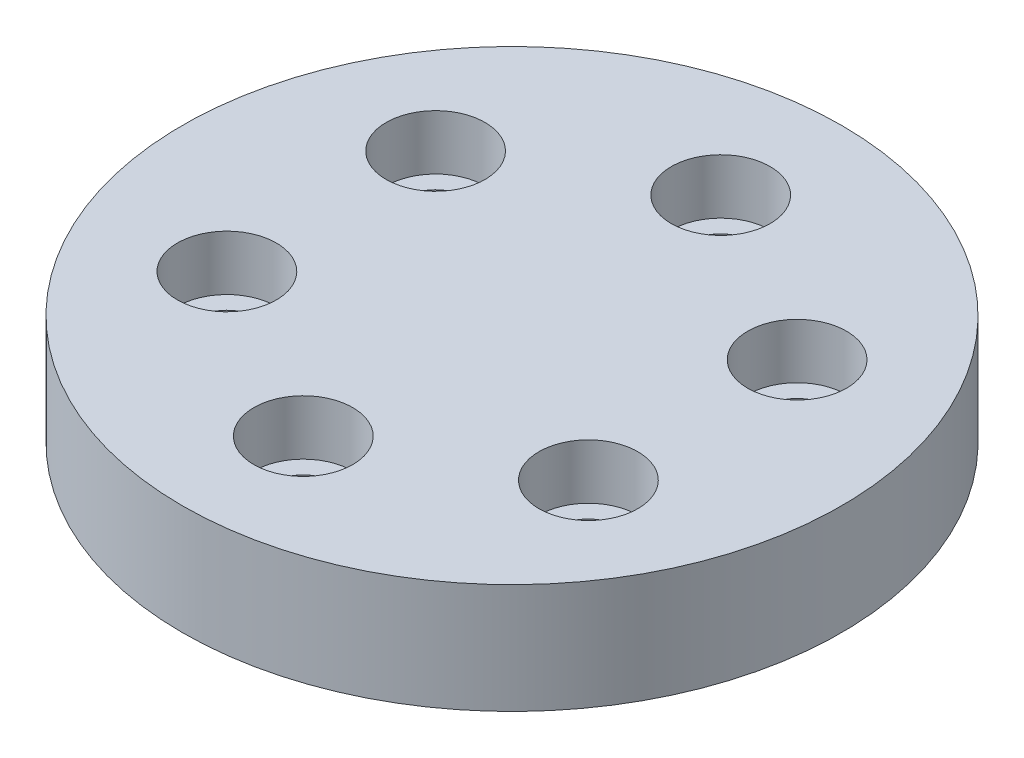
ISO-10303-21;
HEADER;
FILE_DESCRIPTION(('STEP AP214'),'2;1');
FILE_NAME('part.step','',(''),(''),'','','');
FILE_SCHEMA(('AUTOMOTIVE_DESIGN { 1 0 10303 214 1 1 1 1 }'));
ENDSEC;
DATA;
#1=APPLICATION_CONTEXT('core data for automotive mechanical design processes');
#2=APPLICATION_PROTOCOL_DEFINITION('international standard','automotive_design',2000,#1);
#3=PRODUCT_CONTEXT('',#1,'mechanical');
#4=PRODUCT('Part','Part','',(#3));
#5=PRODUCT_RELATED_PRODUCT_CATEGORY('part','',(#4));
#6=PRODUCT_DEFINITION_FORMATION('','',#4);
#7=PRODUCT_DEFINITION_CONTEXT('part definition',#1,'design');
#8=PRODUCT_DEFINITION('design','',#6,#7);
#9=PRODUCT_DEFINITION_SHAPE('','',#8);
#10=(LENGTH_UNIT() NAMED_UNIT(*) SI_UNIT(.MILLI.,.METRE.));
#11=(NAMED_UNIT(*) PLANE_ANGLE_UNIT() SI_UNIT($,.RADIAN.));
#12=(NAMED_UNIT(*) SI_UNIT($,.STERADIAN.) SOLID_ANGLE_UNIT());
#13=UNCERTAINTY_MEASURE_WITH_UNIT(LENGTH_MEASURE(1.E-05),#10,'distance_accuracy_value','');
#14=(GEOMETRIC_REPRESENTATION_CONTEXT(3) GLOBAL_UNCERTAINTY_ASSIGNED_CONTEXT((#13)) GLOBAL_UNIT_ASSIGNED_CONTEXT((#10,
#11,#12)) REPRESENTATION_CONTEXT('',''));
#15=CARTESIAN_POINT('',(0.,0.,0.));
#16=DIRECTION('',(0.,0.,1.));
#17=DIRECTION('',(1.,0.,0.));
#18=AXIS2_PLACEMENT_3D('',#15,#16,#17);
#19=CARTESIAN_POINT('',(0.,10.,0.));
#20=DIRECTION('',(0.,-1.,0.));
#21=DIRECTION('',(0.,0.,-1.));
#22=AXIS2_PLACEMENT_3D('',#19,#20,#21);
#23=CYLINDRICAL_SURFACE('',#22,30.);
#24=CARTESIAN_POINT('',(0.,10.,0.));
#25=DIRECTION('',(0.,1.,0.));
#26=DIRECTION('',(0.,0.,1.));
#27=AXIS2_PLACEMENT_3D('',#24,#25,#26);
#28=CIRCLE('',#27,30.);
#29=CARTESIAN_POINT('',(0.,10.,30.));
#30=VERTEX_POINT('',#29);
#31=EDGE_CURVE('E10',#30,#30,#28,.T.);
#32=ORIENTED_EDGE('',*,*,#31,.F.);
#33=EDGE_LOOP('',(#32));
#34=FACE_BOUND('',#33,.T.);
#35=CARTESIAN_POINT('',(0.,0.,0.));
#36=DIRECTION('',(0.,1.,0.));
#37=DIRECTION('',(0.,0.,1.));
#38=AXIS2_PLACEMENT_3D('',#35,#36,#37);
#39=CIRCLE('',#38,30.);
#40=CARTESIAN_POINT('',(0.,0.,30.));
#41=VERTEX_POINT('',#40);
#42=EDGE_CURVE('E46',#41,#41,#39,.T.);
#43=ORIENTED_EDGE('',*,*,#42,.T.);
#44=EDGE_LOOP('',(#43));
#45=FACE_BOUND('',#44,.T.);
#46=ADVANCED_FACE('F43',(#34,#45),#23,.T.);
#47=CARTESIAN_POINT('',(0.,10.,0.));
#48=DIRECTION('',(0.,1.,0.));
#49=DIRECTION('',(0.,0.,1.));
#50=AXIS2_PLACEMENT_3D('',#47,#48,#49);
#51=PLANE('',#50);
#52=CARTESIAN_POINT('',(0.,10.,-19.));
#53=DIRECTION('',(0.,1.,0.));
#54=DIRECTION('',(0.,0.,1.));
#55=AXIS2_PLACEMENT_3D('',#52,#53,#54);
#56=CIRCLE('',#55,4.5);
#57=CARTESIAN_POINT('',(0.,10.,-14.5));
#58=VERTEX_POINT('',#57);
#59=EDGE_CURVE('E90',#58,#58,#56,.T.);
#60=ORIENTED_EDGE('',*,*,#59,.F.);
#61=EDGE_LOOP('',(#60));
#62=FACE_BOUND('',#61,.T.);
#63=CARTESIAN_POINT('',(-16.4544826719043,10.,-9.5));
#64=DIRECTION('',(0.,1.,0.));
#65=DIRECTION('',(0.,0.,1.));
#66=AXIS2_PLACEMENT_3D('',#63,#64,#65);
#67=CIRCLE('',#66,4.5);
#68=CARTESIAN_POINT('',(-16.4544826719043,10.,-5.));
#69=VERTEX_POINT('',#68);
#70=EDGE_CURVE('E62',#69,#69,#67,.T.);
#71=ORIENTED_EDGE('',*,*,#70,.F.);
#72=EDGE_LOOP('',(#71));
#73=FACE_BOUND('',#72,.T.);
#74=CARTESIAN_POINT('',(-16.4544826719043,10.,9.50000000000001));
#75=DIRECTION('',(0.,1.,0.));
#76=DIRECTION('',(0.,0.,1.));
#77=AXIS2_PLACEMENT_3D('',#74,#75,#76);
#78=CIRCLE('',#77,4.5);
#79=CARTESIAN_POINT('',(-16.4544826719043,10.,14.));
#80=VERTEX_POINT('',#79);
#81=EDGE_CURVE('E61',#80,#80,#78,.T.);
#82=ORIENTED_EDGE('',*,*,#81,.F.);
#83=EDGE_LOOP('',(#82));
#84=FACE_BOUND('',#83,.T.);
#85=CARTESIAN_POINT('',(0.,10.,19.));
#86=DIRECTION('',(0.,1.,0.));
#87=DIRECTION('',(0.,0.,1.));
#88=AXIS2_PLACEMENT_3D('',#85,#86,#87);
#89=CIRCLE('',#88,4.5);
#90=CARTESIAN_POINT('',(0.,10.,23.5));
#91=VERTEX_POINT('',#90);
#92=EDGE_CURVE('E70',#91,#91,#89,.T.);
#93=ORIENTED_EDGE('',*,*,#92,.F.);
#94=EDGE_LOOP('',(#93));
#95=FACE_BOUND('',#94,.T.);
#96=CARTESIAN_POINT('',(16.4544826719043,10.,9.5));
#97=DIRECTION('',(0.,1.,0.));
#98=DIRECTION('',(0.,0.,1.));
#99=AXIS2_PLACEMENT_3D('',#96,#97,#98);
#100=CIRCLE('',#99,4.5);
#101=CARTESIAN_POINT('',(16.4544826719043,10.,14.));
#102=VERTEX_POINT('',#101);
#103=EDGE_CURVE('E78',#102,#102,#100,.T.);
#104=ORIENTED_EDGE('',*,*,#103,.F.);
#105=EDGE_LOOP('',(#104));
#106=FACE_BOUND('',#105,.T.);
#107=CARTESIAN_POINT('',(16.4544826719043,10.,-9.5));
#108=DIRECTION('',(0.,1.,0.));
#109=DIRECTION('',(0.,0.,1.));
#110=AXIS2_PLACEMENT_3D('',#107,#108,#109);
#111=CIRCLE('',#110,4.5);
#112=CARTESIAN_POINT('',(16.4544826719043,10.,-5.));
#113=VERTEX_POINT('',#112);
#114=EDGE_CURVE('E86',#113,#113,#111,.T.);
#115=ORIENTED_EDGE('',*,*,#114,.F.);
#116=EDGE_LOOP('',(#115));
#117=FACE_BOUND('',#116,.T.);
#118=ORIENTED_EDGE('',*,*,#31,.T.);
#119=EDGE_LOOP('',(#118));
#120=FACE_BOUND('',#119,.T.);
#121=ADVANCED_FACE('F177',(#62,#73,#84,#95,#106,#117,#120),#51,.T.);
#122=CARTESIAN_POINT('',(0.,0.,0.));
#123=DIRECTION('',(0.,1.,0.));
#124=DIRECTION('',(0.,0.,1.));
#125=AXIS2_PLACEMENT_3D('',#122,#123,#124);
#126=PLANE('',#125);
#127=CARTESIAN_POINT('',(0.,0.,-19.));
#128=DIRECTION('',(0.,1.,0.));
#129=DIRECTION('',(0.,0.,1.));
#130=AXIS2_PLACEMENT_3D('',#127,#128,#129);
#131=CIRCLE('',#130,2.75);
#132=CARTESIAN_POINT('',(0.,0.,-16.25));
#133=VERTEX_POINT('',#132);
#134=EDGE_CURVE('E95',#133,#133,#131,.T.);
#135=ORIENTED_EDGE('',*,*,#134,.T.);
#136=EDGE_LOOP('',(#135));
#137=FACE_BOUND('',#136,.T.);
#138=CARTESIAN_POINT('',(-16.4544826719043,0.,-9.5));
#139=DIRECTION('',(0.,1.,0.));
#140=DIRECTION('',(0.,0.,1.));
#141=AXIS2_PLACEMENT_3D('',#138,#139,#140);
#142=CIRCLE('',#141,2.75);
#143=CARTESIAN_POINT('',(-16.4544826719043,0.,-6.75));
#144=VERTEX_POINT('',#143);
#145=EDGE_CURVE('E139',#144,#144,#142,.T.);
#146=ORIENTED_EDGE('',*,*,#145,.T.);
#147=EDGE_LOOP('',(#146));
#148=FACE_BOUND('',#147,.T.);
#149=CARTESIAN_POINT('',(-16.4544826719043,0.,9.50000000000001));
#150=DIRECTION('',(0.,1.,0.));
#151=DIRECTION('',(0.,0.,1.));
#152=AXIS2_PLACEMENT_3D('',#149,#150,#151);
#153=CIRCLE('',#152,2.75);
#154=CARTESIAN_POINT('',(-16.4544826719043,0.,12.25));
#155=VERTEX_POINT('',#154);
#156=EDGE_CURVE('E105',#155,#155,#153,.T.);
#157=ORIENTED_EDGE('',*,*,#156,.T.);
#158=EDGE_LOOP('',(#157));
#159=FACE_BOUND('',#158,.T.);
#160=CARTESIAN_POINT('',(0.,0.,19.));
#161=DIRECTION('',(0.,1.,0.));
#162=DIRECTION('',(0.,0.,1.));
#163=AXIS2_PLACEMENT_3D('',#160,#161,#162);
#164=CIRCLE('',#163,2.75);
#165=CARTESIAN_POINT('',(0.,0.,21.75));
#166=VERTEX_POINT('',#165);
#167=EDGE_CURVE('E114',#166,#166,#164,.T.);
#168=ORIENTED_EDGE('',*,*,#167,.T.);
#169=EDGE_LOOP('',(#168));
#170=FACE_BOUND('',#169,.T.);
#171=CARTESIAN_POINT('',(16.4544826719043,0.,9.5));
#172=DIRECTION('',(0.,1.,0.));
#173=DIRECTION('',(0.,0.,1.));
#174=AXIS2_PLACEMENT_3D('',#171,#172,#173);
#175=CIRCLE('',#174,2.75);
#176=CARTESIAN_POINT('',(16.4544826719043,0.,12.25));
#177=VERTEX_POINT('',#176);
#178=EDGE_CURVE('E122',#177,#177,#175,.T.);
#179=ORIENTED_EDGE('',*,*,#178,.T.);
#180=EDGE_LOOP('',(#179));
#181=FACE_BOUND('',#180,.T.);
#182=CARTESIAN_POINT('',(16.4544826719043,0.,-9.5));
#183=DIRECTION('',(0.,1.,0.));
#184=DIRECTION('',(0.,0.,1.));
#185=AXIS2_PLACEMENT_3D('',#182,#183,#184);
#186=CIRCLE('',#185,2.75);
#187=CARTESIAN_POINT('',(16.4544826719043,0.,-6.75));
#188=VERTEX_POINT('',#187);
#189=EDGE_CURVE('E130',#188,#188,#186,.T.);
#190=ORIENTED_EDGE('',*,*,#189,.T.);
#191=EDGE_LOOP('',(#190));
#192=FACE_BOUND('',#191,.T.);
#193=ORIENTED_EDGE('',*,*,#42,.F.);
#194=EDGE_LOOP('',(#193));
#195=FACE_BOUND('',#194,.T.);
#196=ADVANCED_FACE('F153',(#137,#148,#159,#170,#181,#192,#195),#126,.F.);
#197=CARTESIAN_POINT('',(16.4544826719043,5.,-9.5));
#198=DIRECTION('',(0.,1.,0.));
#199=DIRECTION('',(0.,0.,1.));
#200=AXIS2_PLACEMENT_3D('',#197,#198,#199);
#201=CYLINDRICAL_SURFACE('',#200,4.5);
#202=CARTESIAN_POINT('',(16.4544826719043,5.,-9.5));
#203=DIRECTION('',(0.,1.,0.));
#204=DIRECTION('',(0.,0.,1.));
#205=AXIS2_PLACEMENT_3D('',#202,#203,#204);
#206=CIRCLE('',#205,4.5);
#207=CARTESIAN_POINT('',(16.4544826719043,5.,-5.));
#208=VERTEX_POINT('',#207);
#209=EDGE_CURVE('E82',#208,#208,#206,.T.);
#210=ORIENTED_EDGE('',*,*,#209,.F.);
#211=EDGE_LOOP('',(#210));
#212=FACE_BOUND('',#211,.T.);
#213=ORIENTED_EDGE('',*,*,#114,.T.);
#214=EDGE_LOOP('',(#213));
#215=FACE_BOUND('',#214,.T.);
#216=ADVANCED_FACE('F191',(#212,#215),#201,.F.);
#217=CARTESIAN_POINT('',(16.4544826719043,5.,-9.5));
#218=DIRECTION('',(0.,1.,0.));
#219=DIRECTION('',(0.,0.,1.));
#220=AXIS2_PLACEMENT_3D('',#217,#218,#219);
#221=PLANE('',#220);
#222=CARTESIAN_POINT('',(16.4544826719043,5.,-9.5));
#223=DIRECTION('',(0.,1.,0.));
#224=DIRECTION('',(0.,0.,1.));
#225=AXIS2_PLACEMENT_3D('',#222,#223,#224);
#226=CIRCLE('',#225,2.75);
#227=CARTESIAN_POINT('',(16.4544826719043,5.,-6.75));
#228=VERTEX_POINT('',#227);
#229=EDGE_CURVE('E134',#228,#228,#226,.T.);
#230=ORIENTED_EDGE('',*,*,#229,.F.);
#231=EDGE_LOOP('',(#230));
#232=FACE_BOUND('',#231,.T.);
#233=ORIENTED_EDGE('',*,*,#209,.T.);
#234=EDGE_LOOP('',(#233));
#235=FACE_BOUND('',#234,.T.);
#236=ADVANCED_FACE('F193',(#232,#235),#221,.T.);
#237=CARTESIAN_POINT('',(16.4544826719043,5.,9.5));
#238=DIRECTION('',(0.,1.,0.));
#239=DIRECTION('',(0.,0.,1.));
#240=AXIS2_PLACEMENT_3D('',#237,#238,#239);
#241=CYLINDRICAL_SURFACE('',#240,4.5);
#242=CARTESIAN_POINT('',(16.4544826719043,5.,9.5));
#243=DIRECTION('',(0.,1.,0.));
#244=DIRECTION('',(0.,0.,1.));
#245=AXIS2_PLACEMENT_3D('',#242,#243,#244);
#246=CIRCLE('',#245,4.5);
#247=CARTESIAN_POINT('',(16.4544826719043,5.,14.));
#248=VERTEX_POINT('',#247);
#249=EDGE_CURVE('E74',#248,#248,#246,.T.);
#250=ORIENTED_EDGE('',*,*,#249,.F.);
#251=EDGE_LOOP('',(#250));
#252=FACE_BOUND('',#251,.T.);
#253=ORIENTED_EDGE('',*,*,#103,.T.);
#254=EDGE_LOOP('',(#253));
#255=FACE_BOUND('',#254,.T.);
#256=ADVANCED_FACE('F200',(#252,#255),#241,.F.);
#257=CARTESIAN_POINT('',(16.4544826719043,5.,9.5));
#258=DIRECTION('',(0.,1.,0.));
#259=DIRECTION('',(0.,0.,1.));
#260=AXIS2_PLACEMENT_3D('',#257,#258,#259);
#261=PLANE('',#260);
#262=CARTESIAN_POINT('',(16.4544826719043,5.,9.5));
#263=DIRECTION('',(0.,1.,0.));
#264=DIRECTION('',(0.,0.,1.));
#265=AXIS2_PLACEMENT_3D('',#262,#263,#264);
#266=CIRCLE('',#265,2.75);
#267=CARTESIAN_POINT('',(16.4544826719043,5.,12.25));
#268=VERTEX_POINT('',#267);
#269=EDGE_CURVE('E126',#268,#268,#266,.T.);
#270=ORIENTED_EDGE('',*,*,#269,.F.);
#271=EDGE_LOOP('',(#270));
#272=FACE_BOUND('',#271,.T.);
#273=ORIENTED_EDGE('',*,*,#249,.T.);
#274=EDGE_LOOP('',(#273));
#275=FACE_BOUND('',#274,.T.);
#276=ADVANCED_FACE('F244',(#272,#275),#261,.T.);
#277=CARTESIAN_POINT('',(0.,5.,19.));
#278=DIRECTION('',(0.,1.,0.));
#279=DIRECTION('',(0.,0.,1.));
#280=AXIS2_PLACEMENT_3D('',#277,#278,#279);
#281=CYLINDRICAL_SURFACE('',#280,4.5);
#282=CARTESIAN_POINT('',(0.,5.,19.));
#283=DIRECTION('',(0.,1.,0.));
#284=DIRECTION('',(0.,0.,1.));
#285=AXIS2_PLACEMENT_3D('',#282,#283,#284);
#286=CIRCLE('',#285,4.5);
#287=CARTESIAN_POINT('',(0.,5.,23.5));
#288=VERTEX_POINT('',#287);
#289=EDGE_CURVE('E66',#288,#288,#286,.T.);
#290=ORIENTED_EDGE('',*,*,#289,.F.);
#291=EDGE_LOOP('',(#290));
#292=FACE_BOUND('',#291,.T.);
#293=ORIENTED_EDGE('',*,*,#92,.T.);
#294=EDGE_LOOP('',(#293));
#295=FACE_BOUND('',#294,.T.);
#296=ADVANCED_FACE('F254',(#292,#295),#281,.F.);
#297=CARTESIAN_POINT('',(0.,5.,19.));
#298=DIRECTION('',(0.,1.,0.));
#299=DIRECTION('',(0.,0.,1.));
#300=AXIS2_PLACEMENT_3D('',#297,#298,#299);
#301=PLANE('',#300);
#302=CARTESIAN_POINT('',(0.,5.,19.));
#303=DIRECTION('',(0.,1.,0.));
#304=DIRECTION('',(0.,0.,1.));
#305=AXIS2_PLACEMENT_3D('',#302,#303,#304);
#306=CIRCLE('',#305,2.75);
#307=CARTESIAN_POINT('',(0.,5.,21.75));
#308=VERTEX_POINT('',#307);
#309=EDGE_CURVE('E118',#308,#308,#306,.T.);
#310=ORIENTED_EDGE('',*,*,#309,.F.);
#311=EDGE_LOOP('',(#310));
#312=FACE_BOUND('',#311,.T.);
#313=ORIENTED_EDGE('',*,*,#289,.T.);
#314=EDGE_LOOP('',(#313));
#315=FACE_BOUND('',#314,.T.);
#316=ADVANCED_FACE('F264',(#312,#315),#301,.T.);
#317=CARTESIAN_POINT('',(-16.4544826719043,5.,9.50000000000001));
#318=DIRECTION('',(0.,1.,0.));
#319=DIRECTION('',(0.,0.,1.));
#320=AXIS2_PLACEMENT_3D('',#317,#318,#319);
#321=CYLINDRICAL_SURFACE('',#320,4.5);
#322=CARTESIAN_POINT('',(-16.4544826719043,5.,9.50000000000001));
#323=DIRECTION('',(0.,1.,0.));
#324=DIRECTION('',(0.,0.,1.));
#325=AXIS2_PLACEMENT_3D('',#322,#323,#324);
#326=CIRCLE('',#325,4.5);
#327=CARTESIAN_POINT('',(-16.4544826719043,5.,14.));
#328=VERTEX_POINT('',#327);
#329=EDGE_CURVE('E57',#328,#328,#326,.T.);
#330=ORIENTED_EDGE('',*,*,#329,.F.);
#331=EDGE_LOOP('',(#330));
#332=FACE_BOUND('',#331,.T.);
#333=ORIENTED_EDGE('',*,*,#81,.T.);
#334=EDGE_LOOP('',(#333));
#335=FACE_BOUND('',#334,.T.);
#336=ADVANCED_FACE('F274',(#332,#335),#321,.F.);
#337=CARTESIAN_POINT('',(-16.4544826719043,5.,9.50000000000001));
#338=DIRECTION('',(0.,1.,0.));
#339=DIRECTION('',(0.,0.,1.));
#340=AXIS2_PLACEMENT_3D('',#337,#338,#339);
#341=PLANE('',#340);
#342=CARTESIAN_POINT('',(-16.4544826719043,5.,9.50000000000001));
#343=DIRECTION('',(0.,1.,0.));
#344=DIRECTION('',(0.,0.,1.));
#345=AXIS2_PLACEMENT_3D('',#342,#343,#344);
#346=CIRCLE('',#345,2.75);
#347=CARTESIAN_POINT('',(-16.4544826719043,5.,12.25));
#348=VERTEX_POINT('',#347);
#349=EDGE_CURVE('E109',#348,#348,#346,.T.);
#350=ORIENTED_EDGE('',*,*,#349,.F.);
#351=EDGE_LOOP('',(#350));
#352=FACE_BOUND('',#351,.T.);
#353=ORIENTED_EDGE('',*,*,#329,.T.);
#354=EDGE_LOOP('',(#353));
#355=FACE_BOUND('',#354,.T.);
#356=ADVANCED_FACE('F284',(#352,#355),#341,.T.);
#357=CARTESIAN_POINT('',(-16.4544826719043,5.,-9.5));
#358=DIRECTION('',(0.,1.,0.));
#359=DIRECTION('',(0.,0.,1.));
#360=AXIS2_PLACEMENT_3D('',#357,#358,#359);
#361=CYLINDRICAL_SURFACE('',#360,4.5);
#362=CARTESIAN_POINT('',(-16.4544826719043,5.,-9.5));
#363=DIRECTION('',(0.,1.,0.));
#364=DIRECTION('',(0.,0.,1.));
#365=AXIS2_PLACEMENT_3D('',#362,#363,#364);
#366=CIRCLE('',#365,4.5);
#367=CARTESIAN_POINT('',(-16.4544826719043,5.,-5.));
#368=VERTEX_POINT('',#367);
#369=EDGE_CURVE('E91',#368,#368,#366,.T.);
#370=ORIENTED_EDGE('',*,*,#369,.F.);
#371=EDGE_LOOP('',(#370));
#372=FACE_BOUND('',#371,.T.);
#373=ORIENTED_EDGE('',*,*,#70,.T.);
#374=EDGE_LOOP('',(#373));
#375=FACE_BOUND('',#374,.T.);
#376=ADVANCED_FACE('F294',(#372,#375),#361,.F.);
#377=CARTESIAN_POINT('',(-16.4544826719043,5.,-9.5));
#378=DIRECTION('',(0.,1.,0.));
#379=DIRECTION('',(0.,0.,1.));
#380=AXIS2_PLACEMENT_3D('',#377,#378,#379);
#381=PLANE('',#380);
#382=CARTESIAN_POINT('',(-16.4544826719043,5.,-9.5));
#383=DIRECTION('',(0.,1.,0.));
#384=DIRECTION('',(0.,0.,1.));
#385=AXIS2_PLACEMENT_3D('',#382,#383,#384);
#386=CIRCLE('',#385,2.75);
#387=CARTESIAN_POINT('',(-16.4544826719043,5.,-6.75));
#388=VERTEX_POINT('',#387);
#389=EDGE_CURVE('E110',#388,#388,#386,.T.);
#390=ORIENTED_EDGE('',*,*,#389,.F.);
#391=EDGE_LOOP('',(#390));
#392=FACE_BOUND('',#391,.T.);
#393=ORIENTED_EDGE('',*,*,#369,.T.);
#394=EDGE_LOOP('',(#393));
#395=FACE_BOUND('',#394,.T.);
#396=ADVANCED_FACE('F173',(#392,#395),#381,.T.);
#397=CARTESIAN_POINT('',(0.,5.,-19.));
#398=DIRECTION('',(0.,1.,0.));
#399=DIRECTION('',(0.,0.,1.));
#400=AXIS2_PLACEMENT_3D('',#397,#398,#399);
#401=CYLINDRICAL_SURFACE('',#400,4.5);
#402=CARTESIAN_POINT('',(0.,5.,-19.));
#403=DIRECTION('',(0.,1.,0.));
#404=DIRECTION('',(0.,0.,1.));
#405=AXIS2_PLACEMENT_3D('',#402,#403,#404);
#406=CIRCLE('',#405,4.5);
#407=CARTESIAN_POINT('',(0.,5.,-14.5));
#408=VERTEX_POINT('',#407);
#409=EDGE_CURVE('E55',#408,#408,#406,.T.);
#410=ORIENTED_EDGE('',*,*,#409,.F.);
#411=EDGE_LOOP('',(#410));
#412=FACE_BOUND('',#411,.T.);
#413=ORIENTED_EDGE('',*,*,#59,.T.);
#414=EDGE_LOOP('',(#413));
#415=FACE_BOUND('',#414,.T.);
#416=ADVANCED_FACE('F167',(#412,#415),#401,.F.);
#417=CARTESIAN_POINT('',(0.,5.,-19.));
#418=DIRECTION('',(0.,1.,0.));
#419=DIRECTION('',(0.,0.,1.));
#420=AXIS2_PLACEMENT_3D('',#417,#418,#419);
#421=PLANE('',#420);
#422=CARTESIAN_POINT('',(0.,5.,-19.));
#423=DIRECTION('',(0.,1.,0.));
#424=DIRECTION('',(0.,0.,1.));
#425=AXIS2_PLACEMENT_3D('',#422,#423,#424);
#426=CIRCLE('',#425,2.75);
#427=CARTESIAN_POINT('',(0.,5.,-16.25));
#428=VERTEX_POINT('',#427);
#429=EDGE_CURVE('E138',#428,#428,#426,.T.);
#430=ORIENTED_EDGE('',*,*,#429,.F.);
#431=EDGE_LOOP('',(#430));
#432=FACE_BOUND('',#431,.T.);
#433=ORIENTED_EDGE('',*,*,#409,.T.);
#434=EDGE_LOOP('',(#433));
#435=FACE_BOUND('',#434,.T.);
#436=ADVANCED_FACE('F163',(#432,#435),#421,.T.);
#437=CARTESIAN_POINT('',(16.4544826719043,0.,-9.5));
#438=DIRECTION('',(0.,1.,0.));
#439=DIRECTION('',(0.,0.,1.));
#440=AXIS2_PLACEMENT_3D('',#437,#438,#439);
#441=CYLINDRICAL_SURFACE('',#440,2.75);
#442=ORIENTED_EDGE('',*,*,#189,.F.);
#443=EDGE_LOOP('',(#442));
#444=FACE_BOUND('',#443,.T.);
#445=ORIENTED_EDGE('',*,*,#229,.T.);
#446=EDGE_LOOP('',(#445));
#447=FACE_BOUND('',#446,.T.);
#448=ADVANCED_FACE('F166',(#444,#447),#441,.F.);
#449=CARTESIAN_POINT('',(16.4544826719043,0.,9.5));
#450=DIRECTION('',(0.,1.,0.));
#451=DIRECTION('',(0.,0.,1.));
#452=AXIS2_PLACEMENT_3D('',#449,#450,#451);
#453=CYLINDRICAL_SURFACE('',#452,2.75);
#454=ORIENTED_EDGE('',*,*,#178,.F.);
#455=EDGE_LOOP('',(#454));
#456=FACE_BOUND('',#455,.T.);
#457=ORIENTED_EDGE('',*,*,#269,.T.);
#458=EDGE_LOOP('',(#457));
#459=FACE_BOUND('',#458,.T.);
#460=ADVANCED_FACE('F332',(#456,#459),#453,.F.);
#461=CARTESIAN_POINT('',(0.,0.,19.));
#462=DIRECTION('',(0.,1.,0.));
#463=DIRECTION('',(0.,0.,1.));
#464=AXIS2_PLACEMENT_3D('',#461,#462,#463);
#465=CYLINDRICAL_SURFACE('',#464,2.75);
#466=ORIENTED_EDGE('',*,*,#167,.F.);
#467=EDGE_LOOP('',(#466));
#468=FACE_BOUND('',#467,.T.);
#469=ORIENTED_EDGE('',*,*,#309,.T.);
#470=EDGE_LOOP('',(#469));
#471=FACE_BOUND('',#470,.T.);
#472=ADVANCED_FACE('F342',(#468,#471),#465,.F.);
#473=CARTESIAN_POINT('',(-16.4544826719043,0.,9.50000000000001));
#474=DIRECTION('',(0.,1.,0.));
#475=DIRECTION('',(0.,0.,1.));
#476=AXIS2_PLACEMENT_3D('',#473,#474,#475);
#477=CYLINDRICAL_SURFACE('',#476,2.75);
#478=ORIENTED_EDGE('',*,*,#156,.F.);
#479=EDGE_LOOP('',(#478));
#480=FACE_BOUND('',#479,.T.);
#481=ORIENTED_EDGE('',*,*,#349,.T.);
#482=EDGE_LOOP('',(#481));
#483=FACE_BOUND('',#482,.T.);
#484=ADVANCED_FACE('F352',(#480,#483),#477,.F.);
#485=CARTESIAN_POINT('',(-16.4544826719043,0.,-9.5));
#486=DIRECTION('',(0.,1.,0.));
#487=DIRECTION('',(0.,0.,1.));
#488=AXIS2_PLACEMENT_3D('',#485,#486,#487);
#489=CYLINDRICAL_SURFACE('',#488,2.75);
#490=ORIENTED_EDGE('',*,*,#145,.F.);
#491=EDGE_LOOP('',(#490));
#492=FACE_BOUND('',#491,.T.);
#493=ORIENTED_EDGE('',*,*,#389,.T.);
#494=EDGE_LOOP('',(#493));
#495=FACE_BOUND('',#494,.T.);
#496=ADVANCED_FACE('F159',(#492,#495),#489,.F.);
#497=CARTESIAN_POINT('',(0.,0.,-19.));
#498=DIRECTION('',(0.,1.,0.));
#499=DIRECTION('',(0.,0.,1.));
#500=AXIS2_PLACEMENT_3D('',#497,#498,#499);
#501=CYLINDRICAL_SURFACE('',#500,2.75);
#502=ORIENTED_EDGE('',*,*,#134,.F.);
#503=EDGE_LOOP('',(#502));
#504=FACE_BOUND('',#503,.T.);
#505=ORIENTED_EDGE('',*,*,#429,.T.);
#506=EDGE_LOOP('',(#505));
#507=FACE_BOUND('',#506,.T.);
#508=ADVANCED_FACE('F156',(#504,#507),#501,.F.);
#509=CLOSED_SHELL('',(#46,#121,#196,#216,#236,#256,#276,#296,#316,#336,#356,#376,#396,#416,#436,
#448,#460,#472,#484,#496,#508));
#510=MANIFOLD_SOLID_BREP('B2',#509);
#511=ADVANCED_BREP_SHAPE_REPRESENTATION('',(#18,#510),#14);
#512=SHAPE_DEFINITION_REPRESENTATION(#9,#511);
ENDSEC;
END-ISO-10303-21;
